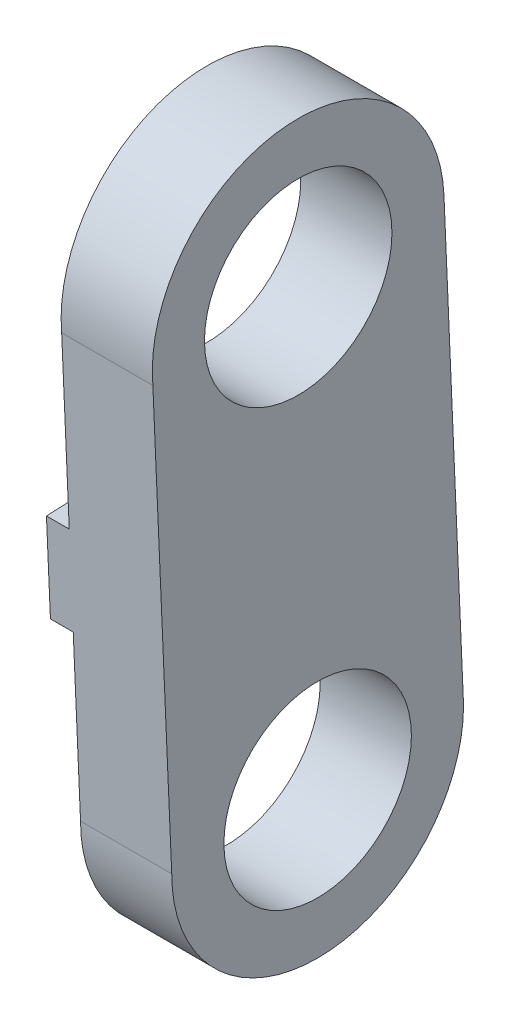
ISO-10303-21;
HEADER;
FILE_DESCRIPTION(('STEP AP214'),'2;1');
FILE_NAME('part.step','',(''),(''),'','','');
FILE_SCHEMA(('AUTOMOTIVE_DESIGN { 1 0 10303 214 1 1 1 1 }'));
ENDSEC;
DATA;
#1=APPLICATION_CONTEXT('core data for automotive mechanical design processes');
#2=APPLICATION_PROTOCOL_DEFINITION('international standard','automotive_design',2000,#1);
#3=PRODUCT_CONTEXT('',#1,'mechanical');
#4=PRODUCT('Part','Part','',(#3));
#5=PRODUCT_RELATED_PRODUCT_CATEGORY('part','',(#4));
#6=PRODUCT_DEFINITION_FORMATION('','',#4);
#7=PRODUCT_DEFINITION_CONTEXT('part definition',#1,'design');
#8=PRODUCT_DEFINITION('design','',#6,#7);
#9=PRODUCT_DEFINITION_SHAPE('','',#8);
#10=(LENGTH_UNIT() NAMED_UNIT(*) SI_UNIT(.MILLI.,.METRE.));
#11=(NAMED_UNIT(*) PLANE_ANGLE_UNIT() SI_UNIT($,.RADIAN.));
#12=(NAMED_UNIT(*) SI_UNIT($,.STERADIAN.) SOLID_ANGLE_UNIT());
#13=UNCERTAINTY_MEASURE_WITH_UNIT(LENGTH_MEASURE(1.E-05),#10,'distance_accuracy_value','');
#14=(GEOMETRIC_REPRESENTATION_CONTEXT(3) GLOBAL_UNCERTAINTY_ASSIGNED_CONTEXT((#13)) GLOBAL_UNIT_ASSIGNED_CONTEXT((#10,
#11,#12)) REPRESENTATION_CONTEXT('',''));
#15=CARTESIAN_POINT('',(0.,0.,0.));
#16=DIRECTION('',(0.,0.,1.));
#17=DIRECTION('',(1.,0.,0.));
#18=AXIS2_PLACEMENT_3D('',#15,#16,#17);
#19=CARTESIAN_POINT('',(0.,15.4962910605336,-177.123417320712));
#20=DIRECTION('',(1.,0.,0.));
#21=DIRECTION('',(0.,0.,-1.));
#22=AXIS2_PLACEMENT_3D('',#19,#20,#21);
#23=PLANE('',#22);
#24=CARTESIAN_POINT('',(0.,15.4962910605336,-177.123417320712));
#25=DIRECTION('',(1.,0.,0.));
#26=DIRECTION('',(0.,0.,-1.));
#27=AXIS2_PLACEMENT_3D('',#24,#25,#26);
#28=CIRCLE('',#27,3.26389999999998);
#29=CARTESIAN_POINT('',(0.,15.4962910605336,-180.387317320712));
#30=VERTEX_POINT('',#29);
#31=EDGE_CURVE('E125',#30,#30,#28,.T.);
#32=ORIENTED_EDGE('',*,*,#31,.T.);
#33=EDGE_LOOP('',(#32));
#34=FACE_BOUND('',#33,.T.);
#35=DIRECTION('',(0.,0.0433123375526137,-0.999061580392184));
#36=VECTOR('',#35,1.);
#37=CARTESIAN_POINT('',(0.,9.00440875416988,-172.326859023459));
#38=LINE('',#37,#36);
#39=CARTESIAN_POINT('',(0.,9.00440875416988,-172.326859023459));
#40=VERTEX_POINT('',#39);
#41=CARTESIAN_POINT('',(0.,9.44416912652305,-182.470566738688));
#42=VERTEX_POINT('',#41);
#43=EDGE_CURVE('E55',#40,#42,#38,.T.);
#44=ORIENTED_EDGE('',*,*,#43,.F.);
#45=DIRECTION('',(0.,-0.999048221581858,-0.0436193873653348));
#46=VECTOR('',#45,1.);
#47=CARTESIAN_POINT('',(0.,15.0535398873755,-172.062748254406));
#48=LINE('',#47,#46);
#49=CARTESIAN_POINT('',(0.,15.0535398873755,-172.062748254406));
#50=VERTEX_POINT('',#49);
#51=EDGE_CURVE('E187',#50,#40,#48,.T.);
#52=ORIENTED_EDGE('',*,*,#51,.F.);
#53=CARTESIAN_POINT('',(0.,15.4962910605336,-177.123417320712));
#54=DIRECTION('',(1.,0.,0.));
#55=DIRECTION('',(0.,0.,-1.));
#56=AXIS2_PLACEMENT_3D('',#53,#54,#55);
#57=CIRCLE('',#56,5.07999999999999);
#58=CARTESIAN_POINT('',(0.,15.7163177353009,-182.198650149105));
#59=VERTEX_POINT('',#58);
#60=EDGE_CURVE('E165',#59,#50,#57,.T.);
#61=ORIENTED_EDGE('',*,*,#60,.F.);
#62=DIRECTION('',(0.,0.999061580392184,0.0433123375526141));
#63=VECTOR('',#62,1.);
#64=CARTESIAN_POINT('',(0.,15.7163177353009,-182.198650149105));
#65=LINE('',#64,#63);
#66=EDGE_CURVE('E60',#42,#59,#65,.T.);
#67=ORIENTED_EDGE('',*,*,#66,.F.);
#68=EDGE_LOOP('',(#44,#52,#61,#67));
#69=FACE_BOUND('',#68,.T.);
#70=ADVANCED_FACE('F39',(#34,#69),#23,.F.);
#71=CARTESIAN_POINT('',(0.,0.,-177.8));
#72=DIRECTION('',(1.,0.,0.));
#73=DIRECTION('',(0.,0.,-1.));
#74=AXIS2_PLACEMENT_3D('',#71,#72,#73);
#75=CIRCLE('',#74,3.26390000000001);
#76=CARTESIAN_POINT('',(0.,0.,-181.0639));
#77=VERTEX_POINT('',#76);
#78=EDGE_CURVE('E157',#77,#77,#75,.T.);
#79=ORIENTED_EDGE('',*,*,#78,.T.);
#80=EDGE_LOOP('',(#79));
#81=FACE_BOUND('',#80,.T.);
#82=DIRECTION('',(0.,-0.043619387365335,0.999048221581858));
#83=VECTOR('',#82,1.);
#84=CARTESIAN_POINT('',(0.,6.27214860877787,-182.608083410417));
#85=LINE('',#84,#83);
#86=CARTESIAN_POINT('',(0.,6.27214860877787,-182.608083410417));
#87=VERTEX_POINT('',#86);
#88=CARTESIAN_POINT('',(0.,5.82931327225011,-172.465486686024));
#89=VERTEX_POINT('',#88);
#90=EDGE_CURVE('E140',#87,#89,#85,.T.);
#91=ORIENTED_EDGE('',*,*,#90,.F.);
#92=CARTESIAN_POINT('',(0.,0.,-182.88));
#93=VERTEX_POINT('',#92);
#94=EDGE_CURVE('E121',#93,#87,#65,.T.);
#95=ORIENTED_EDGE('',*,*,#94,.F.);
#96=CARTESIAN_POINT('',(0.,0.,-177.8));
#97=DIRECTION('',(1.,0.,0.));
#98=DIRECTION('',(0.,0.,-1.));
#99=AXIS2_PLACEMENT_3D('',#96,#97,#98);
#100=CIRCLE('',#99,5.08);
#101=CARTESIAN_POINT('',(0.,0.,-172.72));
#102=VERTEX_POINT('',#101);
#103=EDGE_CURVE('E190',#102,#93,#100,.T.);
#104=ORIENTED_EDGE('',*,*,#103,.F.);
#105=EDGE_CURVE('E186',#89,#102,#48,.T.);
#106=ORIENTED_EDGE('',*,*,#105,.F.);
#107=EDGE_LOOP('',(#91,#95,#104,#106));
#108=FACE_BOUND('',#107,.T.);
#109=ADVANCED_FACE('F210',(#81,#108),#23,.F.);
#110=CARTESIAN_POINT('',(3.175,15.4962910605336,-177.123417320712));
#111=DIRECTION('',(1.,0.,0.));
#112=DIRECTION('',(0.,0.,-1.));
#113=AXIS2_PLACEMENT_3D('',#110,#111,#112);
#114=PLANE('',#113);
#115=CARTESIAN_POINT('',(3.175,0.,-177.8));
#116=DIRECTION('',(1.,0.,0.));
#117=DIRECTION('',(0.,0.,-1.));
#118=AXIS2_PLACEMENT_3D('',#115,#116,#117);
#119=CIRCLE('',#118,3.26390000000001);
#120=CARTESIAN_POINT('',(3.175,0.,-181.0639));
#121=VERTEX_POINT('',#120);
#122=EDGE_CURVE('E161',#121,#121,#119,.T.);
#123=ORIENTED_EDGE('',*,*,#122,.F.);
#124=EDGE_LOOP('',(#123));
#125=FACE_BOUND('',#124,.T.);
#126=CARTESIAN_POINT('',(3.175,15.4962910605336,-177.123417320712));
#127=DIRECTION('',(1.,0.,0.));
#128=DIRECTION('',(0.,0.,-1.));
#129=AXIS2_PLACEMENT_3D('',#126,#127,#128);
#130=CIRCLE('',#129,5.07999999999999);
#131=CARTESIAN_POINT('',(3.175,15.7163177353009,-182.198650149105));
#132=VERTEX_POINT('',#131);
#133=CARTESIAN_POINT('',(3.175,15.0535398873755,-172.062748254406));
#134=VERTEX_POINT('',#133);
#135=EDGE_CURVE('E169',#132,#134,#130,.T.);
#136=ORIENTED_EDGE('',*,*,#135,.T.);
#137=DIRECTION('',(0.,-0.999048221581858,-0.0436193873653348));
#138=VECTOR('',#137,1.);
#139=CARTESIAN_POINT('',(3.175,15.0535398873755,-172.062748254406));
#140=LINE('',#139,#138);
#141=CARTESIAN_POINT('',(3.175,0.,-172.72));
#142=VERTEX_POINT('',#141);
#143=EDGE_CURVE('E173',#134,#142,#140,.T.);
#144=ORIENTED_EDGE('',*,*,#143,.T.);
#145=CARTESIAN_POINT('',(3.175,0.,-177.8));
#146=DIRECTION('',(1.,0.,0.));
#147=DIRECTION('',(0.,0.,-1.));
#148=AXIS2_PLACEMENT_3D('',#145,#146,#147);
#149=CIRCLE('',#148,5.08);
#150=CARTESIAN_POINT('',(3.175,0.,-182.88));
#151=VERTEX_POINT('',#150);
#152=EDGE_CURVE('E176',#142,#151,#149,.T.);
#153=ORIENTED_EDGE('',*,*,#152,.T.);
#154=DIRECTION('',(0.,0.999061580392184,0.0433123375526141));
#155=VECTOR('',#154,1.);
#156=CARTESIAN_POINT('',(3.175,15.7163177353009,-182.198650149105));
#157=LINE('',#156,#155);
#158=EDGE_CURVE('E179',#151,#132,#157,.T.);
#159=ORIENTED_EDGE('',*,*,#158,.T.);
#160=EDGE_LOOP('',(#136,#144,#153,#159));
#161=FACE_BOUND('',#160,.T.);
#162=CARTESIAN_POINT('',(3.175,15.4962910605336,-177.123417320712));
#163=DIRECTION('',(1.,0.,0.));
#164=DIRECTION('',(0.,0.,-1.));
#165=AXIS2_PLACEMENT_3D('',#162,#163,#164);
#166=CIRCLE('',#165,3.26389999999998);
#167=CARTESIAN_POINT('',(3.175,15.4962910605336,-180.387317320712));
#168=VERTEX_POINT('',#167);
#169=EDGE_CURVE('E153',#168,#168,#166,.T.);
#170=ORIENTED_EDGE('',*,*,#169,.F.);
#171=EDGE_LOOP('',(#170));
#172=FACE_BOUND('',#171,.T.);
#173=ADVANCED_FACE('F222',(#125,#161,#172),#114,.T.);
#174=CARTESIAN_POINT('',(3.175,15.4962910605336,-177.123417320712));
#175=DIRECTION('',(-1.,0.,0.));
#176=DIRECTION('',(0.,0.,1.));
#177=AXIS2_PLACEMENT_3D('',#174,#175,#176);
#178=CYLINDRICAL_SURFACE('',#177,5.07999999999999);
#179=ORIENTED_EDGE('',*,*,#60,.T.);
#180=DIRECTION('',(-1.,0.,0.));
#181=VECTOR('',#180,1.);
#182=CARTESIAN_POINT('',(3.175,15.0535398873755,-172.062748254406));
#183=LINE('',#182,#181);
#184=EDGE_CURVE('E11',#134,#50,#183,.T.);
#185=ORIENTED_EDGE('',*,*,#184,.F.);
#186=ORIENTED_EDGE('',*,*,#135,.F.);
#187=DIRECTION('',(-1.,0.,0.));
#188=VECTOR('',#187,1.);
#189=CARTESIAN_POINT('',(3.175,15.7163177353009,-182.198650149105));
#190=LINE('',#189,#188);
#191=EDGE_CURVE('E182',#132,#59,#190,.T.);
#192=ORIENTED_EDGE('',*,*,#191,.T.);
#193=EDGE_LOOP('',(#179,#185,#186,#192));
#194=FACE_BOUND('',#193,.T.);
#195=ADVANCED_FACE('F41',(#194),#178,.T.);
#196=CARTESIAN_POINT('',(3.175,15.0535398873755,-172.062748254406));
#197=DIRECTION('',(0.,0.0436193873653349,-0.999048221581858));
#198=DIRECTION('',(0.,0.999048221581858,0.0436193873653349));
#199=AXIS2_PLACEMENT_3D('',#196,#197,#198);
#200=PLANE('',#199);
#201=ORIENTED_EDGE('',*,*,#51,.T.);
#202=DIRECTION('',(1.,0.,0.));
#203=VECTOR('',#202,1.);
#204=CARTESIAN_POINT('',(-0.79375,9.00440875416988,-172.326859023459));
#205=LINE('',#204,#203);
#206=CARTESIAN_POINT('',(-0.79375,9.00440875416988,-172.326859023459));
#207=VERTEX_POINT('',#206);
#208=EDGE_CURVE('E147',#207,#40,#205,.T.);
#209=ORIENTED_EDGE('',*,*,#208,.F.);
#210=DIRECTION('',(0.,0.999048221581858,0.0436193873653354));
#211=VECTOR('',#210,1.);
#212=CARTESIAN_POINT('',(-0.79375,5.82931327225011,-172.465486686024));
#213=LINE('',#212,#211);
#214=CARTESIAN_POINT('',(-0.79375,5.82931327225011,-172.465486686024));
#215=VERTEX_POINT('',#214);
#216=EDGE_CURVE('E132',#215,#207,#213,.T.);
#217=ORIENTED_EDGE('',*,*,#216,.F.);
#218=DIRECTION('',(1.,0.,0.));
#219=VECTOR('',#218,1.);
#220=CARTESIAN_POINT('',(-0.79375,5.82931327225011,-172.465486686024));
#221=LINE('',#220,#219);
#222=EDGE_CURVE('E126',#215,#89,#221,.T.);
#223=ORIENTED_EDGE('',*,*,#222,.T.);
#224=ORIENTED_EDGE('',*,*,#105,.T.);
#225=DIRECTION('',(-1.,0.,0.));
#226=VECTOR('',#225,1.);
#227=CARTESIAN_POINT('',(3.175,0.,-172.72));
#228=LINE('',#227,#226);
#229=EDGE_CURVE('E48',#142,#102,#228,.T.);
#230=ORIENTED_EDGE('',*,*,#229,.F.);
#231=ORIENTED_EDGE('',*,*,#143,.F.);
#232=ORIENTED_EDGE('',*,*,#184,.T.);
#233=EDGE_LOOP('',(#201,#209,#217,#223,#224,#230,#231,#232));
#234=FACE_BOUND('',#233,.T.);
#235=ADVANCED_FACE('F211',(#234),#200,.F.);
#236=CARTESIAN_POINT('',(3.175,0.,-177.8));
#237=DIRECTION('',(-1.,0.,0.));
#238=DIRECTION('',(0.,0.,1.));
#239=AXIS2_PLACEMENT_3D('',#236,#237,#238);
#240=CYLINDRICAL_SURFACE('',#239,5.08);
#241=ORIENTED_EDGE('',*,*,#103,.T.);
#242=DIRECTION('',(-1.,0.,0.));
#243=VECTOR('',#242,1.);
#244=CARTESIAN_POINT('',(3.175,0.,-182.88));
#245=LINE('',#244,#243);
#246=EDGE_CURVE('E198',#151,#93,#245,.T.);
#247=ORIENTED_EDGE('',*,*,#246,.F.);
#248=ORIENTED_EDGE('',*,*,#152,.F.);
#249=ORIENTED_EDGE('',*,*,#229,.T.);
#250=EDGE_LOOP('',(#241,#247,#248,#249));
#251=FACE_BOUND('',#250,.T.);
#252=ADVANCED_FACE('F206',(#251),#240,.T.);
#253=CARTESIAN_POINT('',(3.175,15.7163177353009,-182.198650149105));
#254=DIRECTION('',(0.,-0.0433123375526141,0.999061580392184));
#255=DIRECTION('',(0.,-0.999061580392184,-0.0433123375526141));
#256=AXIS2_PLACEMENT_3D('',#253,#254,#255);
#257=PLANE('',#256);
#258=ORIENTED_EDGE('',*,*,#94,.T.);
#259=DIRECTION('',(1.,0.,0.));
#260=VECTOR('',#259,1.);
#261=CARTESIAN_POINT('',(-0.79375,6.27214860877787,-182.608083410417));
#262=LINE('',#261,#260);
#263=CARTESIAN_POINT('',(-0.79375,6.27214860877787,-182.608083410417));
#264=VERTEX_POINT('',#263);
#265=EDGE_CURVE('E117',#264,#87,#262,.T.);
#266=ORIENTED_EDGE('',*,*,#265,.F.);
#267=DIRECTION('',(0.,-0.999061580392184,-0.0433123375526189));
#268=VECTOR('',#267,1.);
#269=CARTESIAN_POINT('',(-0.79375,9.44416912652305,-182.470566738688));
#270=LINE('',#269,#268);
#271=CARTESIAN_POINT('',(-0.79375,9.44416912652305,-182.470566738688));
#272=VERTEX_POINT('',#271);
#273=EDGE_CURVE('E102',#272,#264,#270,.T.);
#274=ORIENTED_EDGE('',*,*,#273,.F.);
#275=DIRECTION('',(1.,0.,0.));
#276=VECTOR('',#275,1.);
#277=CARTESIAN_POINT('',(-0.79375,9.44416912652305,-182.470566738688));
#278=LINE('',#277,#276);
#279=EDGE_CURVE('E139',#272,#42,#278,.T.);
#280=ORIENTED_EDGE('',*,*,#279,.T.);
#281=ORIENTED_EDGE('',*,*,#66,.T.);
#282=ORIENTED_EDGE('',*,*,#191,.F.);
#283=ORIENTED_EDGE('',*,*,#158,.F.);
#284=ORIENTED_EDGE('',*,*,#246,.T.);
#285=EDGE_LOOP('',(#258,#266,#274,#280,#281,#282,#283,#284));
#286=FACE_BOUND('',#285,.T.);
#287=ADVANCED_FACE('F118',(#286),#257,.F.);
#288=CARTESIAN_POINT('',(3.175,0.,-177.8));
#289=DIRECTION('',(-1.,0.,0.));
#290=DIRECTION('',(0.,0.,1.));
#291=AXIS2_PLACEMENT_3D('',#288,#289,#290);
#292=CYLINDRICAL_SURFACE('',#291,3.26390000000001);
#293=ORIENTED_EDGE('',*,*,#122,.T.);
#294=EDGE_LOOP('',(#293));
#295=FACE_BOUND('',#294,.T.);
#296=ORIENTED_EDGE('',*,*,#78,.F.);
#297=EDGE_LOOP('',(#296));
#298=FACE_BOUND('',#297,.T.);
#299=ADVANCED_FACE('F232',(#295,#298),#292,.F.);
#300=CARTESIAN_POINT('',(3.175,15.4962910605336,-177.123417320712));
#301=DIRECTION('',(-1.,0.,0.));
#302=DIRECTION('',(0.,0.,1.));
#303=AXIS2_PLACEMENT_3D('',#300,#301,#302);
#304=CYLINDRICAL_SURFACE('',#303,3.26389999999998);
#305=ORIENTED_EDGE('',*,*,#169,.T.);
#306=EDGE_LOOP('',(#305));
#307=FACE_BOUND('',#306,.T.);
#308=ORIENTED_EDGE('',*,*,#31,.F.);
#309=EDGE_LOOP('',(#308));
#310=FACE_BOUND('',#309,.T.);
#311=ADVANCED_FACE('F229',(#307,#310),#304,.F.);
#312=CARTESIAN_POINT('',(-0.79375,6.27214860877787,-182.608083410417));
#313=DIRECTION('',(0.,0.999048221581858,0.043619387365335));
#314=DIRECTION('',(0.,-0.043619387365335,0.999048221581858));
#315=AXIS2_PLACEMENT_3D('',#312,#313,#314);
#316=PLANE('',#315);
#317=ORIENTED_EDGE('',*,*,#90,.T.);
#318=ORIENTED_EDGE('',*,*,#222,.F.);
#319=DIRECTION('',(0.,-0.043619387365335,0.999048221581858));
#320=VECTOR('',#319,1.);
#321=CARTESIAN_POINT('',(-0.79375,6.27214860877787,-182.608083410417));
#322=LINE('',#321,#320);
#323=EDGE_CURVE('E106',#264,#215,#322,.T.);
#324=ORIENTED_EDGE('',*,*,#323,.F.);
#325=ORIENTED_EDGE('',*,*,#265,.T.);
#326=EDGE_LOOP('',(#317,#318,#324,#325));
#327=FACE_BOUND('',#326,.T.);
#328=ADVANCED_FACE('F128',(#327),#316,.F.);
#329=CARTESIAN_POINT('',(-0.79375,9.00440875416988,-172.326859023459));
#330=DIRECTION('',(0.,-0.999061580392184,-0.0433123375526137));
#331=DIRECTION('',(0.,0.0433123375526137,-0.999061580392184));
#332=AXIS2_PLACEMENT_3D('',#329,#330,#331);
#333=PLANE('',#332);
#334=ORIENTED_EDGE('',*,*,#43,.T.);
#335=ORIENTED_EDGE('',*,*,#279,.F.);
#336=DIRECTION('',(0.,0.0433123375526137,-0.999061580392184));
#337=VECTOR('',#336,1.);
#338=CARTESIAN_POINT('',(-0.79375,9.00440875416988,-172.326859023459));
#339=LINE('',#338,#337);
#340=EDGE_CURVE('E109',#207,#272,#339,.T.);
#341=ORIENTED_EDGE('',*,*,#340,.F.);
#342=ORIENTED_EDGE('',*,*,#208,.T.);
#343=EDGE_LOOP('',(#334,#335,#341,#342));
#344=FACE_BOUND('',#343,.T.);
#345=ADVANCED_FACE('F214',(#344),#333,.F.);
#346=CARTESIAN_POINT('',(-0.79375,0.,0.));
#347=DIRECTION('',(1.,0.,0.));
#348=DIRECTION('',(0.,0.,-1.));
#349=AXIS2_PLACEMENT_3D('',#346,#347,#348);
#350=PLANE('',#349);
#351=ORIENTED_EDGE('',*,*,#273,.T.);
#352=ORIENTED_EDGE('',*,*,#323,.T.);
#353=ORIENTED_EDGE('',*,*,#216,.T.);
#354=ORIENTED_EDGE('',*,*,#340,.T.);
#355=EDGE_LOOP('',(#351,#352,#353,#354));
#356=FACE_BOUND('',#355,.T.);
#357=ADVANCED_FACE('F104',(#356),#350,.F.);
#358=CLOSED_SHELL('',(#70,#109,#173,#195,#235,#252,#287,#299,#311,#328,#345,#357));
#359=MANIFOLD_SOLID_BREP('B2',#358);
#360=ADVANCED_BREP_SHAPE_REPRESENTATION('',(#18,#359),#14);
#361=SHAPE_DEFINITION_REPRESENTATION(#9,#360);
ENDSEC;
END-ISO-10303-21;
